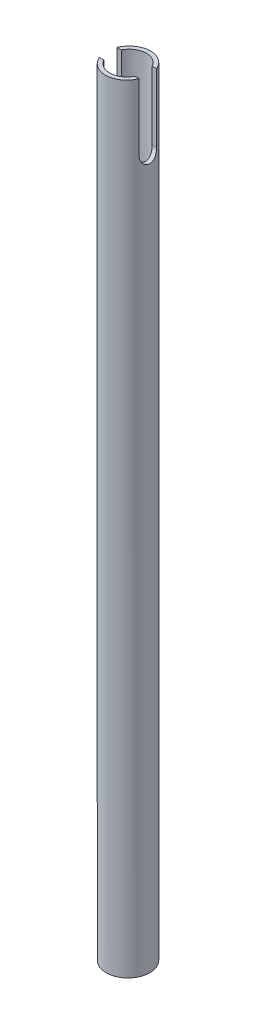
ISO-10303-21;
HEADER;
FILE_DESCRIPTION(('STEP AP214'),'2;1');
FILE_NAME('part.step','',(''),(''),'','','');
FILE_SCHEMA(('AUTOMOTIVE_DESIGN { 1 0 10303 214 1 1 1 1 }'));
ENDSEC;
DATA;
#1=APPLICATION_CONTEXT('core data for automotive mechanical design processes');
#2=APPLICATION_PROTOCOL_DEFINITION('international standard','automotive_design',2000,#1);
#3=PRODUCT_CONTEXT('',#1,'mechanical');
#4=PRODUCT('Part','Part','',(#3));
#5=PRODUCT_RELATED_PRODUCT_CATEGORY('part','',(#4));
#6=PRODUCT_DEFINITION_FORMATION('','',#4);
#7=PRODUCT_DEFINITION_CONTEXT('part definition',#1,'design');
#8=PRODUCT_DEFINITION('design','',#6,#7);
#9=PRODUCT_DEFINITION_SHAPE('','',#8);
#10=(LENGTH_UNIT() NAMED_UNIT(*) SI_UNIT(.MILLI.,.METRE.));
#11=(NAMED_UNIT(*) PLANE_ANGLE_UNIT() SI_UNIT($,.RADIAN.));
#12=(NAMED_UNIT(*) SI_UNIT($,.STERADIAN.) SOLID_ANGLE_UNIT());
#13=UNCERTAINTY_MEASURE_WITH_UNIT(LENGTH_MEASURE(1.E-05),#10,'distance_accuracy_value','');
#14=(GEOMETRIC_REPRESENTATION_CONTEXT(3) GLOBAL_UNCERTAINTY_ASSIGNED_CONTEXT((#13)) GLOBAL_UNIT_ASSIGNED_CONTEXT((#10,
#11,#12)) REPRESENTATION_CONTEXT('',''));
#15=CARTESIAN_POINT('',(0.,0.,0.));
#16=DIRECTION('',(0.,0.,1.));
#17=DIRECTION('',(1.,0.,0.));
#18=AXIS2_PLACEMENT_3D('',#15,#16,#17);
#19=CARTESIAN_POINT('',(0.,331.28597894288,0.));
#20=DIRECTION('',(0.,-1.,0.));
#21=DIRECTION('',(0.,0.,-1.));
#22=AXIS2_PLACEMENT_3D('',#19,#20,#21);
#23=CYLINDRICAL_SURFACE('',#22,7.9375);
#24=CARTESIAN_POINT('',(0.,0.,0.));
#25=DIRECTION('',(0.,1.,0.));
#26=DIRECTION('',(0.,0.,1.));
#27=AXIS2_PLACEMENT_3D('',#24,#25,#26);
#28=CIRCLE('',#27,7.9375);
#29=CARTESIAN_POINT('',(0.,0.,7.9375));
#30=VERTEX_POINT('',#29);
#31=EDGE_CURVE('E203',#30,#30,#28,.T.);
#32=ORIENTED_EDGE('',*,*,#31,.T.);
#33=EDGE_LOOP('',(#32));
#34=FACE_BOUND('',#33,.T.);
#35=DIRECTION('',(0.,-1.,0.));
#36=VECTOR('',#35,1.);
#37=CARTESIAN_POINT('',(-7.2748389157424,331.28597894288,3.175));
#38=LINE('',#37,#36);
#39=CARTESIAN_POINT('',(-7.27483891574239,258.815449166684,3.175));
#40=VERTEX_POINT('',#39);
#41=CARTESIAN_POINT('',(-7.2748389157424,283.136741166043,3.175));
#42=VERTEX_POINT('',#41);
#43=EDGE_CURVE('E146',#40,#42,#38,.F.);
#44=ORIENTED_EDGE('',*,*,#43,.F.);
#45=CARTESIAN_POINT('',(-7.27483891574239,258.815449166684,-3.175));
#46=CARTESIAN_POINT('',(-7.2748213734673,258.730032375836,-3.17501266882702));
#47=CARTESIAN_POINT('',(-7.2763428589775,258.644625172611,-3.17155340043565));
#48=CARTESIAN_POINT('',(-7.2823328035035,258.474499730705,-3.15779000732847));
#49=CARTESIAN_POINT('',(-7.28680014012065,258.389781242056,-3.14748848956709));
#50=CARTESIAN_POINT('',(-7.29852780386515,258.221967337459,-3.12019320836238));
#51=CARTESIAN_POINT('',(-7.30577708764083,258.138866852014,-3.10322589952439));
#52=CARTESIAN_POINT('',(-7.32282084608483,257.974549191587,-3.06278962927675));
#53=CARTESIAN_POINT('',(-7.3326154761132,257.893332131894,-3.03932027099635));
#54=CARTESIAN_POINT('',(-7.36535374856867,257.653501003885,-2.95952817722213));
#55=CARTESIAN_POINT('',(-7.39167700537415,257.498373075465,-2.89376627017735));
#56=CARTESIAN_POINT('',(-7.45033388590046,257.201286183301,-2.73920254152611));
#57=CARTESIAN_POINT('',(-7.48267321509131,257.059339913852,-2.65037881684982));
#58=CARTESIAN_POINT('',(-7.55175336550834,256.784620111969,-2.4468428923214));
#59=CARTESIAN_POINT('',(-7.588634899463,256.652691209844,-2.33103600963011));
#60=CARTESIAN_POINT('',(-7.66147804996073,256.409528984528,-2.07914313305183));
#61=CARTESIAN_POINT('',(-7.69743947634238,256.298299910105,-1.94305298619928));
#62=CARTESIAN_POINT('',(-7.76610424655586,256.095416515981,-1.64783437907488));
#63=CARTESIAN_POINT('',(-7.79862271461643,256.004709282294,-1.48800809365191));
#64=CARTESIAN_POINT('',(-7.85501261299655,255.851834200978,-1.15383332747063));
#65=CARTESIAN_POINT('',(-7.87888765130921,255.789654442332,-0.979490943577494));
#66=CARTESIAN_POINT('',(-7.91429574508624,255.698645010716,-0.630185812820626));
#67=CARTESIAN_POINT('',(-7.92637039529115,255.668346386182,-0.45566179819325));
#68=CARTESIAN_POINT('',(-7.93877492459936,255.637228950711,-0.103613634211552));
#69=CARTESIAN_POINT('',(-7.93910896442721,255.636399696198,0.0739094300030685));
#70=CARTESIAN_POINT('',(-7.92832361516669,255.663440688124,0.41629548779019));
#71=CARTESIAN_POINT('',(-7.91784651916131,255.689701480153,0.581309494992134));
#72=CARTESIAN_POINT('',(-7.88748217026596,255.767438680254,0.904358712556969));
#73=CARTESIAN_POINT('',(-7.86759438481231,255.818916515397,1.06239352740444));
#74=CARTESIAN_POINT('',(-7.81997467816327,255.946259483412,1.36984988491622));
#75=CARTESIAN_POINT('',(-7.7921290207194,256.022480573547,1.51910565802054));
#76=CARTESIAN_POINT('',(-7.73135683541739,256.196810963743,1.80309420082015));
#77=CARTESIAN_POINT('',(-7.69842852631223,256.29492794275,1.93782185081833));
#78=CARTESIAN_POINT('',(-7.62828318752464,256.517774736996,2.19831250886755));
#79=CARTESIAN_POINT('',(-7.59092651959626,256.643827879471,2.32290812422053));
#80=CARTESIAN_POINT('',(-7.51779639956165,256.915168778063,2.54968017957911));
#81=CARTESIAN_POINT('',(-7.48202367463434,257.06046524898,2.6518464058569));
#82=CARTESIAN_POINT('',(-7.41514238501918,257.371614188718,2.83359604410577));
#83=CARTESIAN_POINT('',(-7.38419755733311,257.537937680183,2.9124454400729));
#84=CARTESIAN_POINT('',(-7.34535742834898,257.79647855357,3.00845526999255));
#85=CARTESIAN_POINT('',(-7.33367552004289,257.884145361793,3.03674359852998));
#86=CARTESIAN_POINT('',(-7.31322917691504,258.061911076507,3.08565852812916));
#87=CARTESIAN_POINT('',(-7.30446343423192,258.152008873078,3.10628856431505));
#88=CARTESIAN_POINT('',(-7.28994070197193,258.337173325115,3.14023004946565));
#89=CARTESIAN_POINT('',(-7.2843027635288,258.43230235064,3.15325280299648));
#90=CARTESIAN_POINT('',(-7.27673901487912,258.623432925231,3.17064531592314));
#91=CARTESIAN_POINT('',(-7.2748109173123,258.719433899971,3.17502040721544));
#92=CARTESIAN_POINT('',(-7.27483891574239,258.815449166684,3.175));
#93=B_SPLINE_CURVE_WITH_KNOTS('',3,(#45,#46,#47,#48,#49,#50,#51,#52,#53,#54,#55,#56,#57,#58,#59,
#60,#61,#62,#63,#64,#65,#66,#67,#68,#69,#70,#71,#72,#73,#74,#75,#76,#77,#78,#79,#80,#81,#82,#83,
#84,#85,#86,#87,#88,#89,#90,#91,#92),.UNSPECIFIED.,.F.,.F.,(4,2,2,2,2,2,2,2,2,2,2,2,2,2,2,2,2,2,
2,2,2,2,2,4),(0.,0.256150829294387,0.512204118914552,0.767251309112325,1.02231407025902,
1.53143426526075,2.04103977971416,2.57679901192849,3.11266809105968,3.6697103854465,
4.22651988700748,4.75637028950527,5.28603291779513,5.78594402974511,6.28588343572724,
6.79335980872481,7.30101443548666,7.8419622604596,8.383155909604,8.93991483457339,
9.21815697205885,9.49627415290111,9.78435582473146,10.072259818324),.UNSPECIFIED.);
#94=CARTESIAN_POINT('',(-7.27483891574239,258.815449166684,-3.175));
#95=VERTEX_POINT('',#94);
#96=EDGE_CURVE('E123',#95,#40,#93,.T.);
#97=ORIENTED_EDGE('',*,*,#96,.F.);
#98=DIRECTION('',(0.,-1.,0.));
#99=VECTOR('',#98,1.);
#100=CARTESIAN_POINT('',(-7.2748389157424,331.28597894288,-3.17499999999999));
#101=LINE('',#100,#99);
#102=CARTESIAN_POINT('',(-7.2748389157424,283.136741166043,-3.175));
#103=VERTEX_POINT('',#102);
#104=EDGE_CURVE('E137',#103,#95,#101,.T.);
#105=ORIENTED_EDGE('',*,*,#104,.F.);
#106=CARTESIAN_POINT('',(0.,283.426441549023,0.));
#107=DIRECTION('',(-0.0397907024709352,0.999208036395259,0.));
#108=DIRECTION('',(-0.999208036395259,-0.0397907024709352,0.));
#109=AXIS2_PLACEMENT_3D('',#106,#107,#108);
#110=ELLIPSE('',#109,7.94379119350892,7.9375);
#111=CARTESIAN_POINT('',(7.2748389157424,283.716141932003,-3.175));
#112=VERTEX_POINT('',#111);
#113=EDGE_CURVE('E135',#112,#103,#110,.T.);
#114=ORIENTED_EDGE('',*,*,#113,.F.);
#115=DIRECTION('',(0.,-1.,0.));
#116=VECTOR('',#115,1.);
#117=CARTESIAN_POINT('',(7.2748389157424,331.28597894288,-3.17499999999999));
#118=LINE('',#117,#116);
#119=CARTESIAN_POINT('',(7.2748389157424,258.815449166684,-3.175));
#120=VERTEX_POINT('',#119);
#121=EDGE_CURVE('E61',#120,#112,#118,.F.);
#122=ORIENTED_EDGE('',*,*,#121,.F.);
#123=CARTESIAN_POINT('',(7.2748389157424,258.815449166684,3.175));
#124=CARTESIAN_POINT('',(7.2748213734673,258.730032375836,3.17501266882701));
#125=CARTESIAN_POINT('',(7.2763428589775,258.644625172611,3.17155340043565));
#126=CARTESIAN_POINT('',(7.2823328035035,258.474499730705,3.15779000732846));
#127=CARTESIAN_POINT('',(7.28680014012065,258.389781242056,3.14748848956709));
#128=CARTESIAN_POINT('',(7.29852780386515,258.221967337459,3.12019320836237));
#129=CARTESIAN_POINT('',(7.30577708764083,258.138866852014,3.10322589952439));
#130=CARTESIAN_POINT('',(7.32282084608483,257.974549191587,3.06278962927675));
#131=CARTESIAN_POINT('',(7.3326154761132,257.893332131894,3.03932027099634));
#132=CARTESIAN_POINT('',(7.36535374856867,257.653501003885,2.95952817722213));
#133=CARTESIAN_POINT('',(7.39167700537415,257.498373075465,2.89376627017735));
#134=CARTESIAN_POINT('',(7.45033388590046,257.201286183301,2.73920254152611));
#135=CARTESIAN_POINT('',(7.48267321509131,257.059339913852,2.65037881684982));
#136=CARTESIAN_POINT('',(7.55175336550834,256.784620111969,2.4468428923214));
#137=CARTESIAN_POINT('',(7.588634899463,256.652691209844,2.33103600963011));
#138=CARTESIAN_POINT('',(7.66147804996073,256.409528984528,2.07914313305183));
#139=CARTESIAN_POINT('',(7.69743947634238,256.298299910105,1.94305298619928));
#140=CARTESIAN_POINT('',(7.76610424655587,256.095416515981,1.64783437907488));
#141=CARTESIAN_POINT('',(7.79862271461643,256.004709282294,1.48800809365191));
#142=CARTESIAN_POINT('',(7.85501261299655,255.851834200978,1.15383332747062));
#143=CARTESIAN_POINT('',(7.87888765130921,255.789654442332,0.979490943577491));
#144=CARTESIAN_POINT('',(7.91429574508624,255.698645010716,0.630185812820624));
#145=CARTESIAN_POINT('',(7.92637039529115,255.668346386182,0.455661798193247));
#146=CARTESIAN_POINT('',(7.93877492459936,255.637228950711,0.103613634211548));
#147=CARTESIAN_POINT('',(7.93910896442721,255.636399696198,-0.0739094300030716));
#148=CARTESIAN_POINT('',(7.92832361516669,255.663440688124,-0.416295487790192));
#149=CARTESIAN_POINT('',(7.91784651916131,255.689701480153,-0.581309494992136));
#150=CARTESIAN_POINT('',(7.88748217026596,255.767438680254,-0.904358712556971));
#151=CARTESIAN_POINT('',(7.86759438481231,255.818916515397,-1.06239352740444));
#152=CARTESIAN_POINT('',(7.81997467816327,255.946259483412,-1.36984988491622));
#153=CARTESIAN_POINT('',(7.7921290207194,256.022480573547,-1.51910565802055));
#154=CARTESIAN_POINT('',(7.73135683541739,256.196810963743,-1.80309420082015));
#155=CARTESIAN_POINT('',(7.69842852631223,256.29492794275,-1.93782185081833));
#156=CARTESIAN_POINT('',(7.62828318752464,256.517774736996,-2.19831250886756));
#157=CARTESIAN_POINT('',(7.59092651959626,256.643827879471,-2.32290812422053));
#158=CARTESIAN_POINT('',(7.51779639956165,256.915168778063,-2.54968017957911));
#159=CARTESIAN_POINT('',(7.48202367463434,257.06046524898,-2.6518464058569));
#160=CARTESIAN_POINT('',(7.41514238501918,257.371614188718,-2.83359604410578));
#161=CARTESIAN_POINT('',(7.38419755733311,257.537937680183,-2.9124454400729));
#162=CARTESIAN_POINT('',(7.34535742834898,257.79647855357,-3.00845526999255));
#163=CARTESIAN_POINT('',(7.33367552004289,257.884145361793,-3.03674359852998));
#164=CARTESIAN_POINT('',(7.31322917691504,258.061911076507,-3.08565852812916));
#165=CARTESIAN_POINT('',(7.30446343423191,258.152008873078,-3.10628856431505));
#166=CARTESIAN_POINT('',(7.28994070197193,258.337173325115,-3.14023004946565));
#167=CARTESIAN_POINT('',(7.2843027635288,258.43230235064,-3.15325280299648));
#168=CARTESIAN_POINT('',(7.27673901487912,258.623432925231,-3.17064531592315));
#169=CARTESIAN_POINT('',(7.2748109173123,258.719433899971,-3.17502040721544));
#170=CARTESIAN_POINT('',(7.2748389157424,258.815449166684,-3.175));
#171=B_SPLINE_CURVE_WITH_KNOTS('',3,(#123,#124,#125,#126,#127,#128,#129,#130,#131,#132,#133,
#134,#135,#136,#137,#138,#139,#140,#141,#142,#143,#144,#145,#146,#147,#148,#149,#150,#151,#152,
#153,#154,#155,#156,#157,#158,#159,#160,#161,#162,#163,#164,#165,#166,#167,#168,#169,#170),
.UNSPECIFIED.,.F.,.F.,(4,2,2,2,2,2,2,2,2,2,2,2,2,2,2,2,2,2,2,2,2,2,2,4),(0.,0.256150829294386,
0.512204118914552,0.767251309112325,1.02231407025902,1.53143426526075,2.04103977971416,
2.57679901192849,3.11266809105968,3.6697103854465,4.22651988700748,4.75637028950527,
5.28603291779514,5.78594402974511,6.28588343572724,6.79335980872481,7.30101443548666,
7.8419622604596,8.383155909604,8.9399148345734,9.21815697205885,9.49627415290111,
9.78435582473147,10.072259818324),.UNSPECIFIED.);
#172=CARTESIAN_POINT('',(7.2748389157424,258.815449166684,3.175));
#173=VERTEX_POINT('',#172);
#174=EDGE_CURVE('E114',#173,#120,#171,.T.);
#175=ORIENTED_EDGE('',*,*,#174,.F.);
#176=DIRECTION('',(0.,-1.,0.));
#177=VECTOR('',#176,1.);
#178=CARTESIAN_POINT('',(7.2748389157424,331.28597894288,3.175));
#179=LINE('',#178,#177);
#180=CARTESIAN_POINT('',(7.27483891574239,283.716141932003,3.175));
#181=VERTEX_POINT('',#180);
#182=EDGE_CURVE('E151',#181,#173,#179,.T.);
#183=ORIENTED_EDGE('',*,*,#182,.F.);
#184=EDGE_CURVE('E206',#42,#181,#110,.T.);
#185=ORIENTED_EDGE('',*,*,#184,.F.);
#186=EDGE_LOOP('',(#44,#97,#105,#114,#122,#175,#183,#185));
#187=FACE_BOUND('',#186,.T.);
#188=ADVANCED_FACE('F40',(#34,#187),#23,.T.);
#189=CARTESIAN_POINT('',(0.,331.28597894288,0.));
#190=DIRECTION('',(0.,-1.,0.));
#191=DIRECTION('',(0.,0.,-1.));
#192=AXIS2_PLACEMENT_3D('',#189,#190,#191);
#193=CYLINDRICAL_SURFACE('',#192,6.4643);
#194=CARTESIAN_POINT('',(0.,0.,0.));
#195=DIRECTION('',(0.,1.,0.));
#196=DIRECTION('',(0.,0.,1.));
#197=AXIS2_PLACEMENT_3D('',#194,#195,#196);
#198=CIRCLE('',#197,6.4643);
#199=CARTESIAN_POINT('',(0.,0.,6.4643));
#200=VERTEX_POINT('',#199);
#201=EDGE_CURVE('E204',#200,#200,#198,.T.);
#202=ORIENTED_EDGE('',*,*,#201,.F.);
#203=EDGE_LOOP('',(#202));
#204=FACE_BOUND('',#203,.T.);
#205=CARTESIAN_POINT('',(-5.63085690548073,258.815449166684,-3.175));
#206=CARTESIAN_POINT('',(-5.63083314427865,258.732075822053,-3.17501475658537));
#207=CARTESIAN_POINT('',(-5.63270800290612,258.648715637961,-3.17171650894932));
#208=CARTESIAN_POINT('',(-5.64007619078876,258.482717377841,-3.15861005673363));
#209=CARTESIAN_POINT('',(-5.64556738634361,258.400078905106,-3.14880569084843));
#210=CARTESIAN_POINT('',(-5.65994981136478,258.236575416086,-3.12287502503968));
#211=CARTESIAN_POINT('',(-5.66882198481542,258.155703098463,-3.10678414485082));
#212=CARTESIAN_POINT('',(-5.68964152520503,257.99583884168,-3.06848950606601));
#213=CARTESIAN_POINT('',(-5.70158922758274,257.916847108656,-3.04628508066559));
#214=CARTESIAN_POINT('',(-5.74141923049072,257.683782310425,-2.97094683956398));
#215=CARTESIAN_POINT('',(-5.77333408209964,257.533142681042,-2.9090108202004));
#216=CARTESIAN_POINT('',(-5.84425924105451,257.244288111983,-2.76375069900003));
#217=CARTESIAN_POINT('',(-5.8832801090714,257.10609212859,-2.68039468681891));
#218=CARTESIAN_POINT('',(-5.96775511660967,256.834151351115,-2.48697633404428));
#219=CARTESIAN_POINT('',(-6.01347388807208,256.701614316581,-2.37532770540396));
#220=CARTESIAN_POINT('',(-6.10404750316967,256.45623955937,-2.13181920715592));
#221=CARTESIAN_POINT('',(-6.1489021156932,256.343407043171,-1.99995401300493));
#222=CARTESIAN_POINT('',(-6.23617179606458,256.133473966889,-1.70932187954952));
#223=CARTESIAN_POINT('',(-6.27824209999684,256.037860499887,-1.54936740140359));
#224=CARTESIAN_POINT('',(-6.35176072116115,255.875453267829,-1.21319061658813));
#225=CARTESIAN_POINT('',(-6.38321544776103,255.808642106019,-1.03697820811137));
#226=CARTESIAN_POINT('',(-6.43004158193837,255.710516060636,-0.686188092188345));
#227=CARTESIAN_POINT('',(-6.4463738522475,255.67706807572,-0.512338218857008));
#228=CARTESIAN_POINT('',(-6.46469144763397,255.639607487207,-0.160782019690509));
#229=CARTESIAN_POINT('',(-6.46668486855406,255.635578273488,0.0169220731568642));
#230=CARTESIAN_POINT('',(-6.45656772214049,255.656214071376,0.355165464690631));
#231=CARTESIAN_POINT('',(-6.44562758639317,255.678497682161,0.515892945153655));
#232=CARTESIAN_POINT('',(-6.41262380355029,255.746884488501,0.830980900255622));
#233=CARTESIAN_POINT('',(-6.39055953953696,255.792989005109,0.985341021262243));
#234=CARTESIAN_POINT('',(-6.33694807701977,255.908048248137,1.28605792480314));
#235=CARTESIAN_POINT('',(-6.30527071175889,255.977318049171,1.43226999332139));
#236=CARTESIAN_POINT('',(-6.23531544865734,256.136325234975,1.71135796541494));
#237=CARTESIAN_POINT('',(-6.19703506227319,256.226070340598,1.844228810978));
#238=CARTESIAN_POINT('',(-6.11334024943196,256.432986237682,2.10589815284401));
#239=CARTESIAN_POINT('',(-6.06759349912715,256.551920273903,2.23319819913489));
#240=CARTESIAN_POINT('',(-5.97642079952694,256.809073785337,2.46684622430579));
#241=CARTESIAN_POINT('',(-5.93099515323759,256.947309436577,2.57317644688653));
#242=CARTESIAN_POINT('',(-5.84266284464015,257.249512264094,2.76814528378424));
#243=CARTESIAN_POINT('',(-5.80007313328348,257.414528283147,2.85533090866607));
#244=CARTESIAN_POINT('',(-5.74498523796176,257.672905101592,2.96377401450739));
#245=CARTESIAN_POINT('',(-5.72809486991883,257.760793589551,2.99618869442096));
#246=CARTESIAN_POINT('',(-5.69788122082071,257.939630276135,3.0532549442109));
#247=CARTESIAN_POINT('',(-5.68455638707004,258.03057712344,3.07790989407046));
#248=CARTESIAN_POINT('',(-5.65951648210793,258.235694559424,3.12376274190011));
#249=CARTESIAN_POINT('',(-5.64884707083826,258.35046552472,3.14291763203007));
#250=CARTESIAN_POINT('',(-5.63809564796983,258.524018631231,3.16213513069618));
#251=CARTESIAN_POINT('',(-5.63538722073203,258.582158504598,3.16695519983111));
#252=CARTESIAN_POINT('',(-5.63176603795252,258.69867613583,3.17338827752118));
#253=CARTESIAN_POINT('',(-5.63085344341391,258.757053914554,3.17500099852574));
#254=CARTESIAN_POINT('',(-5.63085690548073,258.815449166684,3.175));
#255=B_SPLINE_CURVE_WITH_KNOTS('',3,(#205,#206,#207,#208,#209,#210,#211,#212,#213,#214,#215,
#216,#217,#218,#219,#220,#221,#222,#223,#224,#225,#226,#227,#228,#229,#230,#231,#232,#233,#234,
#235,#236,#237,#238,#239,#240,#241,#242,#243,#244,#245,#246,#247,#248,#249,#250,#251,#252,#253,
#254),.UNSPECIFIED.,.F.,.F.,(4,2,2,2,2,2,2,2,2,2,2,2,2,2,2,2,2,2,2,2,2,2,2,2,4),(0.,
0.250012145988229,0.499876912554615,0.748353725112907,0.996857649784888,1.4924278441344,
1.98874063593385,2.52414179614751,3.05968421079767,3.62982161542682,4.19961416973237,
4.73004882970632,5.26018397799673,5.74579693142524,6.23143681875924,6.72397049630928,
7.21669020692481,7.75472587709896,8.29321519372078,8.8641676370442,9.14936329782648,
9.43443456060701,9.78397951274085,9.95908597830923,10.1342081421097),.UNSPECIFIED.);
#256=CARTESIAN_POINT('',(-5.63085690548073,258.815449166684,-3.175));
#257=VERTEX_POINT('',#256);
#258=CARTESIAN_POINT('',(-5.63085690548073,258.815449166684,3.175));
#259=VERTEX_POINT('',#258);
#260=EDGE_CURVE('E12',#257,#259,#255,.T.);
#261=ORIENTED_EDGE('',*,*,#260,.T.);
#262=DIRECTION('',(0.,-1.,0.));
#263=VECTOR('',#262,1.);
#264=CARTESIAN_POINT('',(-5.63085690548073,331.28597894288,3.175));
#265=LINE('',#264,#263);
#266=CARTESIAN_POINT('',(-5.63085690548073,283.202208212599,3.175));
#267=VERTEX_POINT('',#266);
#268=EDGE_CURVE('E143',#259,#267,#265,.F.);
#269=ORIENTED_EDGE('',*,*,#268,.T.);
#270=CARTESIAN_POINT('',(0.,283.426441549023,0.));
#271=DIRECTION('',(-0.0397907024709352,0.999208036395259,0.));
#272=DIRECTION('',(-0.999208036395259,-0.0397907024709352,0.));
#273=AXIS2_PLACEMENT_3D('',#270,#271,#272);
#274=ELLIPSE('',#273,6.46942354799367,6.4643);
#275=CARTESIAN_POINT('',(5.63085690548073,283.650674885447,3.175));
#276=VERTEX_POINT('',#275);
#277=EDGE_CURVE('E208',#267,#276,#274,.T.);
#278=ORIENTED_EDGE('',*,*,#277,.T.);
#279=DIRECTION('',(0.,-1.,0.));
#280=VECTOR('',#279,1.);
#281=CARTESIAN_POINT('',(5.63085690548073,331.28597894288,3.175));
#282=LINE('',#281,#280);
#283=CARTESIAN_POINT('',(5.63085690548073,258.815449166684,3.175));
#284=VERTEX_POINT('',#283);
#285=EDGE_CURVE('E148',#276,#284,#282,.T.);
#286=ORIENTED_EDGE('',*,*,#285,.T.);
#287=CARTESIAN_POINT('',(5.63085690548073,258.815449166684,3.175));
#288=CARTESIAN_POINT('',(5.63083314427865,258.732075822053,3.17501475658537));
#289=CARTESIAN_POINT('',(5.63270800290612,258.648715637961,3.17171650894932));
#290=CARTESIAN_POINT('',(5.64007619078876,258.482717377841,3.15861005673362));
#291=CARTESIAN_POINT('',(5.64556738634361,258.400078905106,3.14880569084843));
#292=CARTESIAN_POINT('',(5.65994981136479,258.236575416086,3.12287502503968));
#293=CARTESIAN_POINT('',(5.66882198481542,258.155703098463,3.10678414485081));
#294=CARTESIAN_POINT('',(5.68964152520503,257.99583884168,3.06848950606601));
#295=CARTESIAN_POINT('',(5.70158922758274,257.916847108656,3.04628508066559));
#296=CARTESIAN_POINT('',(5.74141923049072,257.683782310425,2.97094683956398));
#297=CARTESIAN_POINT('',(5.77333408209964,257.533142681042,2.9090108202004));
#298=CARTESIAN_POINT('',(5.84425924105451,257.244288111983,2.76375069900003));
#299=CARTESIAN_POINT('',(5.8832801090714,257.10609212859,2.68039468681891));
#300=CARTESIAN_POINT('',(5.96775511660967,256.834151351115,2.48697633404428));
#301=CARTESIAN_POINT('',(6.01347388807208,256.701614316581,2.37532770540396));
#302=CARTESIAN_POINT('',(6.10404750316967,256.45623955937,2.13181920715592));
#303=CARTESIAN_POINT('',(6.1489021156932,256.343407043171,1.99995401300493));
#304=CARTESIAN_POINT('',(6.23617179606458,256.133473966889,1.70932187954952));
#305=CARTESIAN_POINT('',(6.27824209999684,256.037860499887,1.54936740140359));
#306=CARTESIAN_POINT('',(6.35176072116115,255.875453267829,1.21319061658813));
#307=CARTESIAN_POINT('',(6.38321544776103,255.808642106019,1.03697820811137));
#308=CARTESIAN_POINT('',(6.43004158193837,255.710516060636,0.686188092188343));
#309=CARTESIAN_POINT('',(6.4463738522475,255.67706807572,0.512338218857006));
#310=CARTESIAN_POINT('',(6.46469144763397,255.639607487207,0.160782019690507));
#311=CARTESIAN_POINT('',(6.46668486855406,255.635578273488,-0.0169220731568666));
#312=CARTESIAN_POINT('',(6.45656772214049,255.656214071376,-0.355165464690633));
#313=CARTESIAN_POINT('',(6.44562758639317,255.678497682161,-0.515892945153657));
#314=CARTESIAN_POINT('',(6.41262380355029,255.746884488501,-0.830980900255624));
#315=CARTESIAN_POINT('',(6.39055953953696,255.792989005109,-0.985341021262244));
#316=CARTESIAN_POINT('',(6.33694807701977,255.908048248137,-1.28605792480314));
#317=CARTESIAN_POINT('',(6.30527071175889,255.977318049171,-1.43226999332139));
#318=CARTESIAN_POINT('',(6.23531544865734,256.136325234975,-1.71135796541494));
#319=CARTESIAN_POINT('',(6.19703506227319,256.226070340598,-1.844228810978));
#320=CARTESIAN_POINT('',(6.11334024943196,256.432986237682,-2.10589815284401));
#321=CARTESIAN_POINT('',(6.06759349912715,256.551920273903,-2.23319819913489));
#322=CARTESIAN_POINT('',(5.97642079952693,256.809073785337,-2.46684622430579));
#323=CARTESIAN_POINT('',(5.93099515323759,256.947309436577,-2.57317644688653));
#324=CARTESIAN_POINT('',(5.84266284464015,257.249512264094,-2.76814528378424));
#325=CARTESIAN_POINT('',(5.80007313328348,257.414528283147,-2.85533090866607));
#326=CARTESIAN_POINT('',(5.74498523796176,257.672905101592,-2.96377401450739));
#327=CARTESIAN_POINT('',(5.72809486991883,257.760793589551,-2.99618869442096));
#328=CARTESIAN_POINT('',(5.69788122082071,257.939630276135,-3.0532549442109));
#329=CARTESIAN_POINT('',(5.68455638707004,258.03057712344,-3.07790989407046));
#330=CARTESIAN_POINT('',(5.65951648210793,258.235694559424,-3.12376274190011));
#331=CARTESIAN_POINT('',(5.64884707083827,258.35046552472,-3.14291763203007));
#332=CARTESIAN_POINT('',(5.63809564796983,258.524018631231,-3.16213513069618));
#333=CARTESIAN_POINT('',(5.63538722073202,258.582158504598,-3.16695519983111));
#334=CARTESIAN_POINT('',(5.63176603795252,258.69867613583,-3.17338827752118));
#335=CARTESIAN_POINT('',(5.63085344341391,258.757053914554,-3.17500099852574));
#336=CARTESIAN_POINT('',(5.63085690548073,258.815449166684,-3.175));
#337=B_SPLINE_CURVE_WITH_KNOTS('',3,(#287,#288,#289,#290,#291,#292,#293,#294,#295,#296,#297,
#298,#299,#300,#301,#302,#303,#304,#305,#306,#307,#308,#309,#310,#311,#312,#313,#314,#315,#316,
#317,#318,#319,#320,#321,#322,#323,#324,#325,#326,#327,#328,#329,#330,#331,#332,#333,#334,#335,
#336),.UNSPECIFIED.,.F.,.F.,(4,2,2,2,2,2,2,2,2,2,2,2,2,2,2,2,2,2,2,2,2,2,2,2,4),(0.,
0.250012145988229,0.499876912554615,0.748353725112907,0.996857649784888,1.4924278441344,
1.98874063593385,2.52414179614751,3.05968421079767,3.62982161542682,4.19961416973237,
4.73004882970632,5.26018397799674,5.74579693142524,6.23143681875924,6.72397049630928,
7.21669020692481,7.75472587709896,8.29321519372078,8.8641676370442,9.14936329782648,
9.43443456060701,9.78397951274085,9.95908597830923,10.1342081421097),.UNSPECIFIED.);
#338=CARTESIAN_POINT('',(5.63085690548073,258.815449166684,-3.175));
#339=VERTEX_POINT('',#338);
#340=EDGE_CURVE('E54',#284,#339,#337,.T.);
#341=ORIENTED_EDGE('',*,*,#340,.T.);
#342=DIRECTION('',(0.,-1.,0.));
#343=VECTOR('',#342,1.);
#344=CARTESIAN_POINT('',(5.63085690548073,331.28597894288,-3.17499999999999));
#345=LINE('',#344,#343);
#346=CARTESIAN_POINT('',(5.63085690548073,283.650674885447,-3.175));
#347=VERTEX_POINT('',#346);
#348=EDGE_CURVE('E127',#339,#347,#345,.F.);
#349=ORIENTED_EDGE('',*,*,#348,.T.);
#350=CARTESIAN_POINT('',(-5.63085690548073,283.202208212599,-3.175));
#351=VERTEX_POINT('',#350);
#352=EDGE_CURVE('E122',#347,#351,#274,.T.);
#353=ORIENTED_EDGE('',*,*,#352,.T.);
#354=DIRECTION('',(0.,-1.,0.));
#355=VECTOR('',#354,1.);
#356=CARTESIAN_POINT('',(-5.63085690548073,331.28597894288,-3.17499999999999));
#357=LINE('',#356,#355);
#358=EDGE_CURVE('E69',#351,#257,#357,.T.);
#359=ORIENTED_EDGE('',*,*,#358,.T.);
#360=EDGE_LOOP('',(#261,#269,#278,#286,#341,#349,#353,#359));
#361=FACE_BOUND('',#360,.T.);
#362=ADVANCED_FACE('F181',(#204,#361),#193,.F.);
#363=CARTESIAN_POINT('',(0.941918338366124,283.463950847376,3.175));
#364=DIRECTION('',(-0.0397907024709352,0.999208036395259,0.));
#365=DIRECTION('',(-0.999208036395259,-0.0397907024709352,0.));
#366=AXIS2_PLACEMENT_3D('',#363,#364,#365);
#367=PLANE('',#366);
#368=ORIENTED_EDGE('',*,*,#184,.T.);
#369=DIRECTION('',(-0.999208036395259,-0.0397907024709352,0.));
#370=VECTOR('',#369,1.);
#371=CARTESIAN_POINT('',(0.941918338366124,283.463950847376,3.175));
#372=LINE('',#371,#370);
#373=EDGE_CURVE('E178',#181,#276,#372,.T.);
#374=ORIENTED_EDGE('',*,*,#373,.T.);
#375=ORIENTED_EDGE('',*,*,#277,.F.);
#376=EDGE_CURVE('E179',#267,#42,#372,.T.);
#377=ORIENTED_EDGE('',*,*,#376,.T.);
#378=EDGE_LOOP('',(#368,#374,#375,#377));
#379=FACE_BOUND('',#378,.T.);
#380=ADVANCED_FACE('F184',(#379),#367,.T.);
#381=ORIENTED_EDGE('',*,*,#113,.T.);
#382=DIRECTION('',(0.999208036395259,0.0397907024709352,0.));
#383=VECTOR('',#382,1.);
#384=CARTESIAN_POINT('',(0.941918338366124,283.463950847376,-3.175));
#385=LINE('',#384,#383);
#386=EDGE_CURVE('E213',#103,#351,#385,.T.);
#387=ORIENTED_EDGE('',*,*,#386,.T.);
#388=ORIENTED_EDGE('',*,*,#352,.F.);
#389=EDGE_CURVE('E212',#347,#112,#385,.T.);
#390=ORIENTED_EDGE('',*,*,#389,.T.);
#391=EDGE_LOOP('',(#381,#387,#388,#390));
#392=FACE_BOUND('',#391,.T.);
#393=ADVANCED_FACE('F189',(#392),#367,.T.);
#394=CARTESIAN_POINT('',(0.,0.,0.));
#395=DIRECTION('',(0.,1.,0.));
#396=DIRECTION('',(0.,0.,1.));
#397=AXIS2_PLACEMENT_3D('',#394,#395,#396);
#398=PLANE('',#397);
#399=ORIENTED_EDGE('',*,*,#31,.F.);
#400=EDGE_LOOP('',(#399));
#401=FACE_BOUND('',#400,.T.);
#402=ORIENTED_EDGE('',*,*,#201,.T.);
#403=EDGE_LOOP('',(#402));
#404=FACE_BOUND('',#403,.T.);
#405=ADVANCED_FACE('F186',(#401,#404),#398,.F.);
#406=CARTESIAN_POINT('',(9.525,284.215449166684,-3.175));
#407=DIRECTION('',(0.,0.,1.));
#408=DIRECTION('',(0.,-1.,0.));
#409=AXIS2_PLACEMENT_3D('',#406,#407,#408);
#410=PLANE('',#409);
#411=ORIENTED_EDGE('',*,*,#121,.T.);
#412=ORIENTED_EDGE('',*,*,#389,.F.);
#413=ORIENTED_EDGE('',*,*,#348,.F.);
#414=DIRECTION('',(-1.,0.,0.));
#415=VECTOR('',#414,1.);
#416=CARTESIAN_POINT('',(9.525,258.815449166684,-3.175));
#417=LINE('',#416,#415);
#418=EDGE_CURVE('E116',#120,#339,#417,.T.);
#419=ORIENTED_EDGE('',*,*,#418,.F.);
#420=EDGE_LOOP('',(#411,#412,#413,#419));
#421=FACE_BOUND('',#420,.T.);
#422=ADVANCED_FACE('F125',(#421),#410,.T.);
#423=CARTESIAN_POINT('',(9.525,258.815449166684,3.175));
#424=DIRECTION('',(0.,0.,-1.));
#425=DIRECTION('',(-1.,0.,0.));
#426=AXIS2_PLACEMENT_3D('',#423,#424,#425);
#427=PLANE('',#426);
#428=ORIENTED_EDGE('',*,*,#182,.T.);
#429=DIRECTION('',(-1.,0.,0.));
#430=VECTOR('',#429,1.);
#431=CARTESIAN_POINT('',(9.525,258.815449166684,3.175));
#432=LINE('',#431,#430);
#433=EDGE_CURVE('E119',#173,#284,#432,.T.);
#434=ORIENTED_EDGE('',*,*,#433,.T.);
#435=ORIENTED_EDGE('',*,*,#285,.F.);
#436=ORIENTED_EDGE('',*,*,#373,.F.);
#437=EDGE_LOOP('',(#428,#434,#435,#436));
#438=FACE_BOUND('',#437,.T.);
#439=ADVANCED_FACE('F167',(#438),#427,.T.);
#440=CARTESIAN_POINT('',(9.525,258.815449166684,0.));
#441=DIRECTION('',(-1.,0.,0.));
#442=DIRECTION('',(0.,0.,1.));
#443=AXIS2_PLACEMENT_3D('',#440,#441,#442);
#444=CYLINDRICAL_SURFACE('',#443,3.175);
#445=ORIENTED_EDGE('',*,*,#174,.T.);
#446=ORIENTED_EDGE('',*,*,#418,.T.);
#447=ORIENTED_EDGE('',*,*,#340,.F.);
#448=ORIENTED_EDGE('',*,*,#433,.F.);
#449=EDGE_LOOP('',(#445,#446,#447,#448));
#450=FACE_BOUND('',#449,.T.);
#451=ADVANCED_FACE('F115',(#450),#444,.F.);
#452=ORIENTED_EDGE('',*,*,#96,.T.);
#453=EDGE_CURVE('E128',#259,#40,#432,.T.);
#454=ORIENTED_EDGE('',*,*,#453,.F.);
#455=ORIENTED_EDGE('',*,*,#260,.F.);
#456=EDGE_CURVE('E129',#257,#95,#417,.T.);
#457=ORIENTED_EDGE('',*,*,#456,.T.);
#458=EDGE_LOOP('',(#452,#454,#455,#457));
#459=FACE_BOUND('',#458,.T.);
#460=ADVANCED_FACE('F166',(#459),#444,.F.);
#461=ORIENTED_EDGE('',*,*,#43,.T.);
#462=ORIENTED_EDGE('',*,*,#376,.F.);
#463=ORIENTED_EDGE('',*,*,#268,.F.);
#464=ORIENTED_EDGE('',*,*,#453,.T.);
#465=EDGE_LOOP('',(#461,#462,#463,#464));
#466=FACE_BOUND('',#465,.T.);
#467=ADVANCED_FACE('F227',(#466),#427,.T.);
#468=ORIENTED_EDGE('',*,*,#104,.T.);
#469=ORIENTED_EDGE('',*,*,#456,.F.);
#470=ORIENTED_EDGE('',*,*,#358,.F.);
#471=ORIENTED_EDGE('',*,*,#386,.F.);
#472=EDGE_LOOP('',(#468,#469,#470,#471));
#473=FACE_BOUND('',#472,.T.);
#474=ADVANCED_FACE('F168',(#473),#410,.T.);
#475=CLOSED_SHELL('',(#188,#362,#380,#393,#405,#422,#439,#451,#460,#467,#474));
#476=MANIFOLD_SOLID_BREP('B2',#475);
#477=ADVANCED_BREP_SHAPE_REPRESENTATION('',(#18,#476),#14);
#478=SHAPE_DEFINITION_REPRESENTATION(#9,#477);
ENDSEC;
END-ISO-10303-21;
